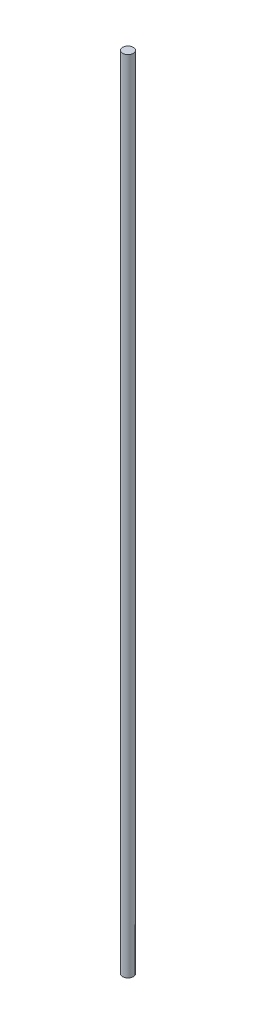
ISO-10303-21;
HEADER;
FILE_DESCRIPTION(('STEP AP214'),'2;1');
FILE_NAME('part.step','',(''),(''),'','','');
FILE_SCHEMA(('AUTOMOTIVE_DESIGN { 1 0 10303 214 1 1 1 1 }'));
ENDSEC;
DATA;
#1=APPLICATION_CONTEXT('core data for automotive mechanical design processes');
#2=APPLICATION_PROTOCOL_DEFINITION('international standard','automotive_design',2000,#1);
#3=PRODUCT_CONTEXT('',#1,'mechanical');
#4=PRODUCT('Part','Part','',(#3));
#5=PRODUCT_RELATED_PRODUCT_CATEGORY('part','',(#4));
#6=PRODUCT_DEFINITION_FORMATION('','',#4);
#7=PRODUCT_DEFINITION_CONTEXT('part definition',#1,'design');
#8=PRODUCT_DEFINITION('design','',#6,#7);
#9=PRODUCT_DEFINITION_SHAPE('','',#8);
#10=(LENGTH_UNIT() NAMED_UNIT(*) SI_UNIT(.MILLI.,.METRE.));
#11=(NAMED_UNIT(*) PLANE_ANGLE_UNIT() SI_UNIT($,.RADIAN.));
#12=(NAMED_UNIT(*) SI_UNIT($,.STERADIAN.) SOLID_ANGLE_UNIT());
#13=UNCERTAINTY_MEASURE_WITH_UNIT(LENGTH_MEASURE(1.E-05),#10,'distance_accuracy_value','');
#14=(GEOMETRIC_REPRESENTATION_CONTEXT(3) GLOBAL_UNCERTAINTY_ASSIGNED_CONTEXT((#13)) GLOBAL_UNIT_ASSIGNED_CONTEXT((#10,
#11,#12)) REPRESENTATION_CONTEXT('',''));
#15=CARTESIAN_POINT('',(0.,0.,0.));
#16=DIRECTION('',(0.,0.,1.));
#17=DIRECTION('',(1.,0.,0.));
#18=AXIS2_PLACEMENT_3D('',#15,#16,#17);
#19=CARTESIAN_POINT('',(0.,236.855,0.));
#20=DIRECTION('',(0.,-1.,0.));
#21=DIRECTION('',(0.,0.,-1.));
#22=AXIS2_PLACEMENT_3D('',#19,#20,#21);
#23=CYLINDRICAL_SURFACE('',#22,3.175);
#24=CARTESIAN_POINT('',(0.,239.395,0.));
#25=DIRECTION('',(0.,1.,0.));
#26=DIRECTION('',(0.,0.,1.));
#27=AXIS2_PLACEMENT_3D('',#24,#25,#26);
#28=CIRCLE('',#27,3.175);
#29=CARTESIAN_POINT('',(0.,239.395,3.175));
#30=VERTEX_POINT('',#29);
#31=EDGE_CURVE('E10',#30,#30,#28,.T.);
#32=ORIENTED_EDGE('',*,*,#31,.F.);
#33=EDGE_LOOP('',(#32));
#34=FACE_BOUND('',#33,.T.);
#35=CARTESIAN_POINT('',(0.,-239.395,0.));
#36=DIRECTION('',(0.,1.,0.));
#37=DIRECTION('',(0.,0.,1.));
#38=AXIS2_PLACEMENT_3D('',#35,#36,#37);
#39=CIRCLE('',#38,3.175);
#40=CARTESIAN_POINT('',(0.,-239.395,3.175));
#41=VERTEX_POINT('',#40);
#42=EDGE_CURVE('E37',#41,#41,#39,.T.);
#43=ORIENTED_EDGE('',*,*,#42,.T.);
#44=EDGE_LOOP('',(#43));
#45=FACE_BOUND('',#44,.T.);
#46=ADVANCED_FACE('F30',(#34,#45),#23,.T.);
#47=CARTESIAN_POINT('',(0.,239.395,0.));
#48=DIRECTION('',(0.,1.,0.));
#49=DIRECTION('',(0.,0.,1.));
#50=AXIS2_PLACEMENT_3D('',#47,#48,#49);
#51=PLANE('',#50);
#52=ORIENTED_EDGE('',*,*,#31,.T.);
#53=EDGE_LOOP('',(#52));
#54=FACE_BOUND('',#53,.T.);
#55=ADVANCED_FACE('F32',(#54),#51,.T.);
#56=CARTESIAN_POINT('',(0.,-239.395,0.));
#57=DIRECTION('',(0.,1.,0.));
#58=DIRECTION('',(0.,0.,1.));
#59=AXIS2_PLACEMENT_3D('',#56,#57,#58);
#60=PLANE('',#59);
#61=ORIENTED_EDGE('',*,*,#42,.F.);
#62=EDGE_LOOP('',(#61));
#63=FACE_BOUND('',#62,.T.);
#64=ADVANCED_FACE('F44',(#63),#60,.F.);
#65=CLOSED_SHELL('',(#46,#55,#64));
#66=MANIFOLD_SOLID_BREP('B2',#65);
#67=ADVANCED_BREP_SHAPE_REPRESENTATION('',(#18,#66),#14);
#68=SHAPE_DEFINITION_REPRESENTATION(#9,#67);
ENDSEC;
END-ISO-10303-21;
